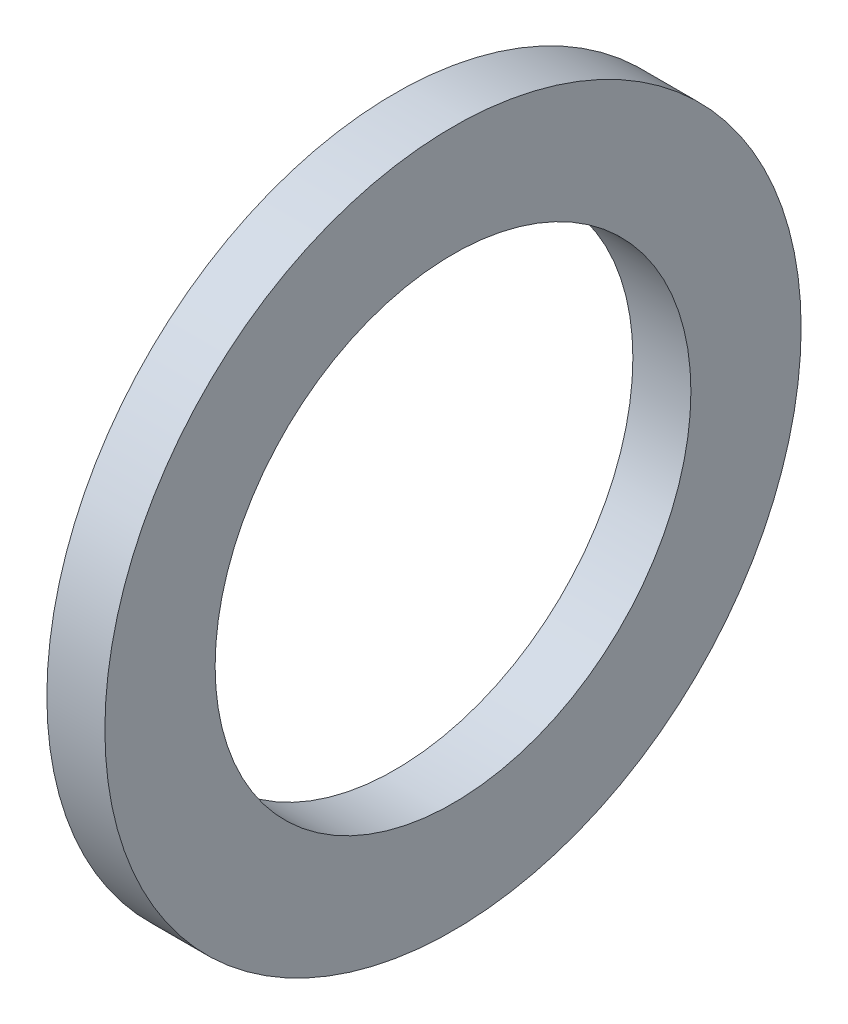
ISO-10303-21;
HEADER;
FILE_DESCRIPTION(('STEP AP214'),'2;1');
FILE_NAME('part.step','',(''),(''),'','','');
FILE_SCHEMA(('AUTOMOTIVE_DESIGN { 1 0 10303 214 1 1 1 1 }'));
ENDSEC;
DATA;
#1=APPLICATION_CONTEXT('core data for automotive mechanical design processes');
#2=APPLICATION_PROTOCOL_DEFINITION('international standard','automotive_design',2000,#1);
#3=PRODUCT_CONTEXT('',#1,'mechanical');
#4=PRODUCT('Part','Part','',(#3));
#5=PRODUCT_RELATED_PRODUCT_CATEGORY('part','',(#4));
#6=PRODUCT_DEFINITION_FORMATION('','',#4);
#7=PRODUCT_DEFINITION_CONTEXT('part definition',#1,'design');
#8=PRODUCT_DEFINITION('design','',#6,#7);
#9=PRODUCT_DEFINITION_SHAPE('','',#8);
#10=(LENGTH_UNIT() NAMED_UNIT(*) SI_UNIT(.MILLI.,.METRE.));
#11=(NAMED_UNIT(*) PLANE_ANGLE_UNIT() SI_UNIT($,.RADIAN.));
#12=(NAMED_UNIT(*) SI_UNIT($,.STERADIAN.) SOLID_ANGLE_UNIT());
#13=UNCERTAINTY_MEASURE_WITH_UNIT(LENGTH_MEASURE(1.E-05),#10,'distance_accuracy_value','');
#14=(GEOMETRIC_REPRESENTATION_CONTEXT(3) GLOBAL_UNCERTAINTY_ASSIGNED_CONTEXT((#13)) GLOBAL_UNIT_ASSIGNED_CONTEXT((#10,
#11,#12)) REPRESENTATION_CONTEXT('',''));
#15=CARTESIAN_POINT('',(0.,0.,0.));
#16=DIRECTION('',(0.,0.,1.));
#17=DIRECTION('',(1.,0.,0.));
#18=AXIS2_PLACEMENT_3D('',#15,#16,#17);
#19=CARTESIAN_POINT('',(0.004199999999969,6.0042,6.004149774017));
#20=DIRECTION('',(1.,0.,0.));
#21=DIRECTION('',(0.,0.,-1.));
#22=AXIS2_PLACEMENT_3D('',#19,#20,#21);
#23=PLANE('',#22);
#24=CARTESIAN_POINT('',(0.004199999999997,6.0042,6.004149774017));
#25=DIRECTION('',(1.,0.,0.));
#26=DIRECTION('',(0.,0.,-1.));
#27=AXIS2_PLACEMENT_3D('',#24,#25,#26);
#28=CIRCLE('',#27,4.1);
#29=CARTESIAN_POINT('',(0.004199999999997,6.0042,1.904149774017));
#30=VERTEX_POINT('',#29);
#31=EDGE_CURVE('E26',#30,#30,#28,.T.);
#32=ORIENTED_EDGE('',*,*,#31,.T.);
#33=EDGE_LOOP('',(#32));
#34=FACE_BOUND('',#33,.T.);
#35=CARTESIAN_POINT('',(0.004199999999997,6.0042,6.004149774017));
#36=DIRECTION('',(1.,0.,0.));
#37=DIRECTION('',(0.,0.,-1.));
#38=AXIS2_PLACEMENT_3D('',#35,#36,#37);
#39=CIRCLE('',#38,6.);
#40=CARTESIAN_POINT('',(0.004199999999997,6.0042,0.00414977401699997));
#41=VERTEX_POINT('',#40);
#42=EDGE_CURVE('E17',#41,#41,#39,.T.);
#43=ORIENTED_EDGE('',*,*,#42,.F.);
#44=EDGE_LOOP('',(#43));
#45=FACE_BOUND('',#44,.T.);
#46=ADVANCED_FACE('F14',(#34,#45),#23,.F.);
#47=CARTESIAN_POINT('',(0.004199999999969,6.0042,6.004149774017));
#48=DIRECTION('',(1.,0.,0.));
#49=DIRECTION('',(0.,0.,-1.));
#50=AXIS2_PLACEMENT_3D('',#47,#48,#49);
#51=CYLINDRICAL_SURFACE('',#50,6.);
#52=ORIENTED_EDGE('',*,*,#42,.T.);
#53=EDGE_LOOP('',(#52));
#54=FACE_BOUND('',#53,.T.);
#55=CARTESIAN_POINT('',(1.0042,6.0042,6.004149774017));
#56=DIRECTION('',(1.,0.,0.));
#57=DIRECTION('',(0.,0.,-1.));
#58=AXIS2_PLACEMENT_3D('',#55,#56,#57);
#59=CIRCLE('',#58,6.);
#60=CARTESIAN_POINT('',(1.0042,6.0042,0.00414977401699997));
#61=VERTEX_POINT('',#60);
#62=EDGE_CURVE('E21',#61,#61,#59,.T.);
#63=ORIENTED_EDGE('',*,*,#62,.F.);
#64=EDGE_LOOP('',(#63));
#65=FACE_BOUND('',#64,.T.);
#66=ADVANCED_FACE('F34',(#54,#65),#51,.T.);
#67=CARTESIAN_POINT('',(0.004199999999969,6.0042,6.004149774017));
#68=DIRECTION('',(1.,0.,0.));
#69=DIRECTION('',(0.,0.,-1.));
#70=AXIS2_PLACEMENT_3D('',#67,#68,#69);
#71=CYLINDRICAL_SURFACE('',#70,4.1);
#72=ORIENTED_EDGE('',*,*,#31,.F.);
#73=EDGE_LOOP('',(#72));
#74=FACE_BOUND('',#73,.T.);
#75=CARTESIAN_POINT('',(1.0042,6.0042,6.004149774017));
#76=DIRECTION('',(1.,0.,0.));
#77=DIRECTION('',(0.,0.,-1.));
#78=AXIS2_PLACEMENT_3D('',#75,#76,#77);
#79=CIRCLE('',#78,4.1);
#80=CARTESIAN_POINT('',(1.0042,6.0042,1.904149774017));
#81=VERTEX_POINT('',#80);
#82=EDGE_CURVE('E10',#81,#81,#79,.F.);
#83=ORIENTED_EDGE('',*,*,#82,.F.);
#84=EDGE_LOOP('',(#83));
#85=FACE_BOUND('',#84,.T.);
#86=ADVANCED_FACE('F42',(#74,#85),#71,.F.);
#87=CARTESIAN_POINT('',(1.0042,6.0042,6.004149774017));
#88=DIRECTION('',(1.,0.,0.));
#89=DIRECTION('',(0.,0.,-1.));
#90=AXIS2_PLACEMENT_3D('',#87,#88,#89);
#91=PLANE('',#90);
#92=ORIENTED_EDGE('',*,*,#82,.T.);
#93=EDGE_LOOP('',(#92));
#94=FACE_BOUND('',#93,.T.);
#95=ORIENTED_EDGE('',*,*,#62,.T.);
#96=EDGE_LOOP('',(#95));
#97=FACE_BOUND('',#96,.T.);
#98=ADVANCED_FACE('F43',(#94,#97),#91,.T.);
#99=CLOSED_SHELL('',(#46,#66,#86,#98));
#100=MANIFOLD_SOLID_BREP('B1',#99);
#101=ADVANCED_BREP_SHAPE_REPRESENTATION('',(#18,#100),#14);
#102=SHAPE_DEFINITION_REPRESENTATION(#9,#101);
ENDSEC;
END-ISO-10303-21;
